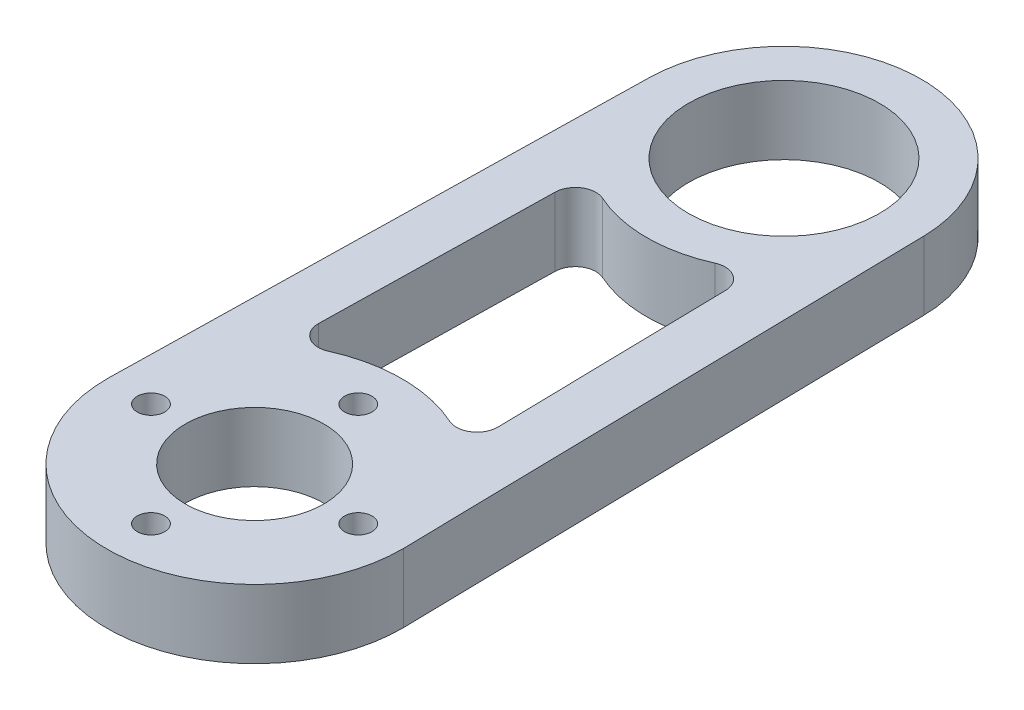
ISO-10303-21;
HEADER;
FILE_DESCRIPTION(('STEP AP214'),'2;1');
FILE_NAME('part.step','',(''),(''),'','','');
FILE_SCHEMA(('AUTOMOTIVE_DESIGN { 1 0 10303 214 1 1 1 1 }'));
ENDSEC;
DATA;
#1=APPLICATION_CONTEXT('core data for automotive mechanical design processes');
#2=APPLICATION_PROTOCOL_DEFINITION('international standard','automotive_design',2000,#1);
#3=PRODUCT_CONTEXT('',#1,'mechanical');
#4=PRODUCT('Part','Part','',(#3));
#5=PRODUCT_RELATED_PRODUCT_CATEGORY('part','',(#4));
#6=PRODUCT_DEFINITION_FORMATION('','',#4);
#7=PRODUCT_DEFINITION_CONTEXT('part definition',#1,'design');
#8=PRODUCT_DEFINITION('design','',#6,#7);
#9=PRODUCT_DEFINITION_SHAPE('','',#8);
#10=(LENGTH_UNIT() NAMED_UNIT(*) SI_UNIT(.MILLI.,.METRE.));
#11=(NAMED_UNIT(*) PLANE_ANGLE_UNIT() SI_UNIT($,.RADIAN.));
#12=(NAMED_UNIT(*) SI_UNIT($,.STERADIAN.) SOLID_ANGLE_UNIT());
#13=UNCERTAINTY_MEASURE_WITH_UNIT(LENGTH_MEASURE(1.E-05),#10,'distance_accuracy_value','');
#14=(GEOMETRIC_REPRESENTATION_CONTEXT(3) GLOBAL_UNCERTAINTY_ASSIGNED_CONTEXT((#13)) GLOBAL_UNIT_ASSIGNED_CONTEXT((#10,
#11,#12)) REPRESENTATION_CONTEXT('',''));
#15=CARTESIAN_POINT('',(0.,0.,0.));
#16=DIRECTION('',(0.,0.,1.));
#17=DIRECTION('',(1.,0.,0.));
#18=AXIS2_PLACEMENT_3D('',#15,#16,#17);
#19=CARTESIAN_POINT('',(0.,10.,0.));
#20=DIRECTION('',(0.,1.,0.));
#21=DIRECTION('',(0.,0.,1.));
#22=AXIS2_PLACEMENT_3D('',#19,#20,#21);
#23=PLANE('',#22);
#24=CARTESIAN_POINT('',(0.,10.,-15.1));
#25=DIRECTION('',(0.,1.,0.));
#26=DIRECTION('',(0.,0.,1.));
#27=AXIS2_PLACEMENT_3D('',#24,#25,#26);
#28=CIRCLE('',#27,2.);
#29=CARTESIAN_POINT('',(0.,10.,-13.1));
#30=VERTEX_POINT('',#29);
#31=EDGE_CURVE('E348',#30,#30,#28,.T.);
#32=ORIENTED_EDGE('',*,*,#31,.F.);
#33=EDGE_LOOP('',(#32));
#34=FACE_BOUND('',#33,.T.);
#35=CARTESIAN_POINT('',(15.1,10.,0.));
#36=DIRECTION('',(0.,1.,0.));
#37=DIRECTION('',(0.,0.,1.));
#38=AXIS2_PLACEMENT_3D('',#35,#36,#37);
#39=CIRCLE('',#38,2.);
#40=CARTESIAN_POINT('',(15.1,10.,2.));
#41=VERTEX_POINT('',#40);
#42=EDGE_CURVE('E166',#41,#41,#39,.T.);
#43=ORIENTED_EDGE('',*,*,#42,.F.);
#44=EDGE_LOOP('',(#43));
#45=FACE_BOUND('',#44,.T.);
#46=CARTESIAN_POINT('',(0.,10.,-77.125));
#47=DIRECTION('',(0.,1.,0.));
#48=DIRECTION('',(0.,0.,1.));
#49=AXIS2_PLACEMENT_3D('',#46,#47,#48);
#50=CIRCLE('',#49,13.91353128046);
#51=CARTESIAN_POINT('',(0.,10.,-63.21146871954));
#52=VERTEX_POINT('',#51);
#53=EDGE_CURVE('E202',#52,#52,#50,.T.);
#54=ORIENTED_EDGE('',*,*,#53,.F.);
#55=EDGE_LOOP('',(#54));
#56=FACE_BOUND('',#55,.T.);
#57=CARTESIAN_POINT('',(0.,10.,0.));
#58=DIRECTION('',(0.,1.,0.));
#59=DIRECTION('',(0.,0.,1.));
#60=AXIS2_PLACEMENT_3D('',#57,#58,#59);
#61=CIRCLE('',#60,21.5);
#62=CARTESIAN_POINT('',(-21.4989833019733,10.,-0.209086062360846));
#63=VERTEX_POINT('',#62);
#64=CARTESIAN_POINT('',(21.4989833019733,10.,-0.209086062360846));
#65=VERTEX_POINT('',#64);
#66=EDGE_CURVE('E208',#63,#65,#61,.T.);
#67=ORIENTED_EDGE('',*,*,#66,.T.);
#68=DIRECTION('',(-0.0194357996688067,0.,-0.999811107005335));
#69=VECTOR('',#68,1.);
#70=CARTESIAN_POINT('',(21.4989833019733,10.,-0.209086062360846));
#71=LINE('',#70,#69);
#72=CARTESIAN_POINT('',(19.996222140098,10.,-77.5137159938233));
#73=VERTEX_POINT('',#72);
#74=EDGE_CURVE('E211',#65,#73,#71,.T.);
#75=ORIENTED_EDGE('',*,*,#74,.T.);
#76=CARTESIAN_POINT('',(0.,10.,-77.125));
#77=DIRECTION('',(0.,1.,0.));
#78=DIRECTION('',(0.,0.,1.));
#79=AXIS2_PLACEMENT_3D('',#76,#77,#78);
#80=CIRCLE('',#79,20.);
#81=CARTESIAN_POINT('',(-19.996222140098,10.,-77.5137159938233));
#82=VERTEX_POINT('',#81);
#83=EDGE_CURVE('E214',#73,#82,#80,.T.);
#84=ORIENTED_EDGE('',*,*,#83,.T.);
#85=DIRECTION('',(-0.0194357996688067,0.,0.999811107005335));
#86=VECTOR('',#85,1.);
#87=CARTESIAN_POINT('',(-21.4989833019733,10.,-0.209086062360846));
#88=LINE('',#87,#86);
#89=EDGE_CURVE('E216',#82,#63,#88,.T.);
#90=ORIENTED_EDGE('',*,*,#89,.T.);
#91=EDGE_LOOP('',(#67,#75,#84,#90));
#92=FACE_BOUND('',#91,.T.);
#93=CARTESIAN_POINT('',(0.,10.,0.));
#94=DIRECTION('',(0.,1.,0.));
#95=DIRECTION('',(0.,0.,1.));
#96=AXIS2_PLACEMENT_3D('',#93,#94,#95);
#97=CIRCLE('',#96,10.1);
#98=CARTESIAN_POINT('',(0.,10.,10.1));
#99=VERTEX_POINT('',#98);
#100=EDGE_CURVE('E196',#99,#99,#97,.T.);
#101=ORIENTED_EDGE('',*,*,#100,.F.);
#102=EDGE_LOOP('',(#101));
#103=FACE_BOUND('',#102,.T.);
#104=CARTESIAN_POINT('',(0.,10.,0.));
#105=DIRECTION('',(0.,-1.,0.));
#106=DIRECTION('',(0.,0.,-1.));
#107=AXIS2_PLACEMENT_3D('',#104,#105,#106);
#108=CIRCLE('',#107,21.5);
#109=CARTESIAN_POINT('',(-8.8347388916758,10.,-19.6009537705671));
#110=VERTEX_POINT('',#109);
#111=CARTESIAN_POINT('',(8.8347388916758,10.,-19.6009537705672));
#112=VERTEX_POINT('',#111);
#113=EDGE_CURVE('E136',#110,#112,#108,.T.);
#114=ORIENTED_EDGE('',*,*,#113,.F.);
#115=CARTESIAN_POINT('',(-10.0674931556306,10.,-22.3359705757626));
#116=DIRECTION('',(0.,1.,0.));
#117=DIRECTION('',(0.,0.,1.));
#118=AXIS2_PLACEMENT_3D('',#115,#116,#117);
#119=CIRCLE('',#118,3.);
#120=CARTESIAN_POINT('',(-13.0669257096839,10.,-22.3943174153088));
#121=VERTEX_POINT('',#120);
#122=EDGE_CURVE('E128',#121,#110,#119,.T.);
#123=ORIENTED_EDGE('',*,*,#122,.F.);
#124=DIRECTION('',(-0.0194489465153976,0.,0.999810851351115));
#125=VECTOR('',#124,1.);
#126=CARTESIAN_POINT('',(-13.0669257096839,10.,-22.3943174153088));
#127=LINE('',#126,#125);
#128=CARTESIAN_POINT('',(-12.4093868221489,10.,-56.1963803919542));
#129=VERTEX_POINT('',#128);
#130=EDGE_CURVE('E163',#129,#121,#127,.T.);
#131=ORIENTED_EDGE('',*,*,#130,.F.);
#132=CARTESIAN_POINT('',(-9.40995426809551,10.,-56.138033552408));
#133=DIRECTION('',(0.,1.,0.));
#134=DIRECTION('',(0.,0.,-1.));
#135=AXIS2_PLACEMENT_3D('',#132,#133,#134);
#136=CIRCLE('',#135,3.);
#137=CARTESIAN_POINT('',(-8.18256892877871,10.,-58.8754639586157));
#138=VERTEX_POINT('',#137);
#139=EDGE_CURVE('E161',#138,#129,#136,.T.);
#140=ORIENTED_EDGE('',*,*,#139,.F.);
#141=CARTESIAN_POINT('',(0.,10.,-77.125));
#142=DIRECTION('',(0.,-1.,0.));
#143=DIRECTION('',(0.,0.,1.));
#144=AXIS2_PLACEMENT_3D('',#141,#142,#143);
#145=CIRCLE('',#144,20.);
#146=CARTESIAN_POINT('',(8.1825689287787,10.,-58.8754639586157));
#147=VERTEX_POINT('',#146);
#148=EDGE_CURVE('E159',#147,#138,#145,.T.);
#149=ORIENTED_EDGE('',*,*,#148,.F.);
#150=CARTESIAN_POINT('',(9.40995426809551,10.,-56.138033552408));
#151=DIRECTION('',(0.,1.,0.));
#152=DIRECTION('',(0.,0.,1.));
#153=AXIS2_PLACEMENT_3D('',#150,#151,#152);
#154=CIRCLE('',#153,3.);
#155=CARTESIAN_POINT('',(12.4093868221489,10.,-56.1963803919542));
#156=VERTEX_POINT('',#155);
#157=EDGE_CURVE('E157',#156,#147,#154,.T.);
#158=ORIENTED_EDGE('',*,*,#157,.F.);
#159=DIRECTION('',(-0.0194489465153976,0.,-0.999810851351115));
#160=VECTOR('',#159,1.);
#161=CARTESIAN_POINT('',(13.0669257096839,10.,-22.3943174153088));
#162=LINE('',#161,#160);
#163=CARTESIAN_POINT('',(13.0669257096839,10.,-22.3943174153088));
#164=VERTEX_POINT('',#163);
#165=EDGE_CURVE('E152',#164,#156,#162,.T.);
#166=ORIENTED_EDGE('',*,*,#165,.F.);
#167=CARTESIAN_POINT('',(10.0674931556306,10.,-22.3359705757626));
#168=DIRECTION('',(0.,1.,0.));
#169=DIRECTION('',(0.,0.,-1.));
#170=AXIS2_PLACEMENT_3D('',#167,#168,#169);
#171=CIRCLE('',#170,3.);
#172=EDGE_CURVE('E150',#112,#164,#171,.T.);
#173=ORIENTED_EDGE('',*,*,#172,.F.);
#174=EDGE_LOOP('',(#114,#123,#131,#140,#149,#158,#166,#173));
#175=FACE_BOUND('',#174,.T.);
#176=CARTESIAN_POINT('',(-15.1,10.,0.));
#177=DIRECTION('',(0.,1.,0.));
#178=DIRECTION('',(0.,0.,-1.));
#179=AXIS2_PLACEMENT_3D('',#176,#177,#178);
#180=CIRCLE('',#179,2.);
#181=CARTESIAN_POINT('',(-15.1,10.,-2.));
#182=VERTEX_POINT('',#181);
#183=EDGE_CURVE('E354',#182,#182,#180,.T.);
#184=ORIENTED_EDGE('',*,*,#183,.F.);
#185=EDGE_LOOP('',(#184));
#186=FACE_BOUND('',#185,.T.);
#187=CARTESIAN_POINT('',(0.,10.,15.1));
#188=DIRECTION('',(0.,1.,0.));
#189=DIRECTION('',(0.,0.,-1.));
#190=AXIS2_PLACEMENT_3D('',#187,#188,#189);
#191=CIRCLE('',#190,2.);
#192=CARTESIAN_POINT('',(0.,10.,13.1));
#193=VERTEX_POINT('',#192);
#194=EDGE_CURVE('E339',#193,#193,#191,.T.);
#195=ORIENTED_EDGE('',*,*,#194,.F.);
#196=EDGE_LOOP('',(#195));
#197=FACE_BOUND('',#196,.T.);
#198=ADVANCED_FACE('F39',(#34,#45,#56,#92,#103,#175,#186,#197),#23,.T.);
#199=CARTESIAN_POINT('',(0.,0.,0.));
#200=DIRECTION('',(0.,1.,0.));
#201=DIRECTION('',(0.,0.,1.));
#202=AXIS2_PLACEMENT_3D('',#199,#200,#201);
#203=PLANE('',#202);
#204=CARTESIAN_POINT('',(0.,0.,0.));
#205=DIRECTION('',(0.,1.,0.));
#206=DIRECTION('',(0.,0.,1.));
#207=AXIS2_PLACEMENT_3D('',#204,#205,#206);
#208=CIRCLE('',#207,10.1);
#209=CARTESIAN_POINT('',(0.,0.,10.1));
#210=VERTEX_POINT('',#209);
#211=EDGE_CURVE('E144',#210,#210,#208,.T.);
#212=ORIENTED_EDGE('',*,*,#211,.T.);
#213=EDGE_LOOP('',(#212));
#214=FACE_BOUND('',#213,.T.);
#215=CARTESIAN_POINT('',(0.,0.,-77.125));
#216=DIRECTION('',(0.,1.,0.));
#217=DIRECTION('',(0.,0.,1.));
#218=AXIS2_PLACEMENT_3D('',#215,#216,#217);
#219=CIRCLE('',#218,13.91353128046);
#220=CARTESIAN_POINT('',(0.,0.,-63.21146871954));
#221=VERTEX_POINT('',#220);
#222=EDGE_CURVE('E199',#221,#221,#219,.T.);
#223=ORIENTED_EDGE('',*,*,#222,.T.);
#224=EDGE_LOOP('',(#223));
#225=FACE_BOUND('',#224,.T.);
#226=CARTESIAN_POINT('',(0.,0.,0.));
#227=DIRECTION('',(0.,1.,0.));
#228=DIRECTION('',(0.,0.,1.));
#229=AXIS2_PLACEMENT_3D('',#226,#227,#228);
#230=CIRCLE('',#229,21.5);
#231=CARTESIAN_POINT('',(-21.4989833019733,0.,-0.209086062360846));
#232=VERTEX_POINT('',#231);
#233=CARTESIAN_POINT('',(21.4989833019733,0.,-0.209086062360846));
#234=VERTEX_POINT('',#233);
#235=EDGE_CURVE('E205',#232,#234,#230,.T.);
#236=ORIENTED_EDGE('',*,*,#235,.F.);
#237=DIRECTION('',(-0.0194357996688067,0.,0.999811107005335));
#238=VECTOR('',#237,1.);
#239=CARTESIAN_POINT('',(-21.4989833019733,0.,-0.209086062360846));
#240=LINE('',#239,#238);
#241=CARTESIAN_POINT('',(-19.996222140098,0.,-77.5137159938233));
#242=VERTEX_POINT('',#241);
#243=EDGE_CURVE('E212',#242,#232,#240,.T.);
#244=ORIENTED_EDGE('',*,*,#243,.F.);
#245=CARTESIAN_POINT('',(0.,0.,-77.125));
#246=DIRECTION('',(0.,1.,0.));
#247=DIRECTION('',(0.,0.,1.));
#248=AXIS2_PLACEMENT_3D('',#245,#246,#247);
#249=CIRCLE('',#248,20.);
#250=CARTESIAN_POINT('',(19.996222140098,0.,-77.5137159938233));
#251=VERTEX_POINT('',#250);
#252=EDGE_CURVE('E223',#251,#242,#249,.T.);
#253=ORIENTED_EDGE('',*,*,#252,.F.);
#254=DIRECTION('',(-0.0194357996688067,0.,-0.999811107005335));
#255=VECTOR('',#254,1.);
#256=CARTESIAN_POINT('',(21.4989833019733,0.,-0.209086062360846));
#257=LINE('',#256,#255);
#258=EDGE_CURVE('E221',#234,#251,#257,.T.);
#259=ORIENTED_EDGE('',*,*,#258,.F.);
#260=EDGE_LOOP('',(#236,#244,#253,#259));
#261=FACE_BOUND('',#260,.T.);
#262=CARTESIAN_POINT('',(-10.0674931556306,0.,-22.3359705757626));
#263=DIRECTION('',(0.,1.,0.));
#264=DIRECTION('',(0.,0.,1.));
#265=AXIS2_PLACEMENT_3D('',#262,#263,#264);
#266=CIRCLE('',#265,3.);
#267=CARTESIAN_POINT('',(-13.0669257096839,0.,-22.3943174153088));
#268=VERTEX_POINT('',#267);
#269=CARTESIAN_POINT('',(-8.8347388916758,0.,-19.6009537705671));
#270=VERTEX_POINT('',#269);
#271=EDGE_CURVE('E62',#268,#270,#266,.T.);
#272=ORIENTED_EDGE('',*,*,#271,.T.);
#273=CARTESIAN_POINT('',(0.,0.,0.));
#274=DIRECTION('',(0.,-1.,0.));
#275=DIRECTION('',(0.,0.,-1.));
#276=AXIS2_PLACEMENT_3D('',#273,#274,#275);
#277=CIRCLE('',#276,21.5);
#278=CARTESIAN_POINT('',(8.8347388916758,0.,-19.6009537705672));
#279=VERTEX_POINT('',#278);
#280=EDGE_CURVE('E143',#270,#279,#277,.T.);
#281=ORIENTED_EDGE('',*,*,#280,.T.);
#282=CARTESIAN_POINT('',(10.0674931556306,0.,-22.3359705757626));
#283=DIRECTION('',(0.,1.,0.));
#284=DIRECTION('',(0.,0.,-1.));
#285=AXIS2_PLACEMENT_3D('',#282,#283,#284);
#286=CIRCLE('',#285,3.);
#287=CARTESIAN_POINT('',(13.0669257096839,0.,-22.3943174153088));
#288=VERTEX_POINT('',#287);
#289=EDGE_CURVE('E168',#279,#288,#286,.T.);
#290=ORIENTED_EDGE('',*,*,#289,.T.);
#291=DIRECTION('',(-0.0194489465153976,0.,-0.999810851351115));
#292=VECTOR('',#291,1.);
#293=CARTESIAN_POINT('',(13.0669257096839,0.,-22.3943174153088));
#294=LINE('',#293,#292);
#295=CARTESIAN_POINT('',(12.4093868221489,0.,-56.1963803919542));
#296=VERTEX_POINT('',#295);
#297=EDGE_CURVE('E171',#288,#296,#294,.T.);
#298=ORIENTED_EDGE('',*,*,#297,.T.);
#299=CARTESIAN_POINT('',(9.40995426809551,0.,-56.138033552408));
#300=DIRECTION('',(0.,1.,0.));
#301=DIRECTION('',(0.,0.,1.));
#302=AXIS2_PLACEMENT_3D('',#299,#300,#301);
#303=CIRCLE('',#302,3.);
#304=CARTESIAN_POINT('',(8.1825689287787,0.,-58.8754639586157));
#305=VERTEX_POINT('',#304);
#306=EDGE_CURVE('E174',#296,#305,#303,.T.);
#307=ORIENTED_EDGE('',*,*,#306,.T.);
#308=CARTESIAN_POINT('',(0.,0.,-77.125));
#309=DIRECTION('',(0.,-1.,0.));
#310=DIRECTION('',(0.,0.,1.));
#311=AXIS2_PLACEMENT_3D('',#308,#309,#310);
#312=CIRCLE('',#311,20.);
#313=CARTESIAN_POINT('',(-8.18256892877871,0.,-58.8754639586157));
#314=VERTEX_POINT('',#313);
#315=EDGE_CURVE('E177',#305,#314,#312,.T.);
#316=ORIENTED_EDGE('',*,*,#315,.T.);
#317=CARTESIAN_POINT('',(-9.40995426809551,0.,-56.138033552408));
#318=DIRECTION('',(0.,1.,0.));
#319=DIRECTION('',(0.,0.,-1.));
#320=AXIS2_PLACEMENT_3D('',#317,#318,#319);
#321=CIRCLE('',#320,3.);
#322=CARTESIAN_POINT('',(-12.4093868221489,0.,-56.1963803919542));
#323=VERTEX_POINT('',#322);
#324=EDGE_CURVE('E180',#314,#323,#321,.T.);
#325=ORIENTED_EDGE('',*,*,#324,.T.);
#326=DIRECTION('',(-0.0194489465153976,0.,0.999810851351115));
#327=VECTOR('',#326,1.);
#328=CARTESIAN_POINT('',(-13.0669257096839,0.,-22.3943174153088));
#329=LINE('',#328,#327);
#330=EDGE_CURVE('E137',#323,#268,#329,.T.);
#331=ORIENTED_EDGE('',*,*,#330,.T.);
#332=EDGE_LOOP('',(#272,#281,#290,#298,#307,#316,#325,#331));
#333=FACE_BOUND('',#332,.T.);
#334=CARTESIAN_POINT('',(15.1,0.,0.));
#335=DIRECTION('',(0.,1.,0.));
#336=DIRECTION('',(0.,0.,1.));
#337=AXIS2_PLACEMENT_3D('',#334,#335,#336);
#338=CIRCLE('',#337,2.);
#339=CARTESIAN_POINT('',(15.1,0.,2.));
#340=VERTEX_POINT('',#339);
#341=EDGE_CURVE('E357',#340,#340,#338,.T.);
#342=ORIENTED_EDGE('',*,*,#341,.T.);
#343=EDGE_LOOP('',(#342));
#344=FACE_BOUND('',#343,.T.);
#345=CARTESIAN_POINT('',(-15.1,0.,0.));
#346=DIRECTION('',(0.,1.,0.));
#347=DIRECTION('',(0.,0.,-1.));
#348=AXIS2_PLACEMENT_3D('',#345,#346,#347);
#349=CIRCLE('',#348,2.);
#350=CARTESIAN_POINT('',(-15.1,0.,-2.));
#351=VERTEX_POINT('',#350);
#352=EDGE_CURVE('E351',#351,#351,#349,.T.);
#353=ORIENTED_EDGE('',*,*,#352,.T.);
#354=EDGE_LOOP('',(#353));
#355=FACE_BOUND('',#354,.T.);
#356=CARTESIAN_POINT('',(0.,0.,-15.1));
#357=DIRECTION('',(0.,1.,0.));
#358=DIRECTION('',(0.,0.,1.));
#359=AXIS2_PLACEMENT_3D('',#356,#357,#358);
#360=CIRCLE('',#359,2.);
#361=CARTESIAN_POINT('',(0.,0.,-13.1));
#362=VERTEX_POINT('',#361);
#363=EDGE_CURVE('E345',#362,#362,#360,.T.);
#364=ORIENTED_EDGE('',*,*,#363,.T.);
#365=EDGE_LOOP('',(#364));
#366=FACE_BOUND('',#365,.T.);
#367=CARTESIAN_POINT('',(0.,0.,15.1));
#368=DIRECTION('',(0.,1.,0.));
#369=DIRECTION('',(0.,0.,-1.));
#370=AXIS2_PLACEMENT_3D('',#367,#368,#369);
#371=CIRCLE('',#370,2.);
#372=CARTESIAN_POINT('',(0.,0.,13.1));
#373=VERTEX_POINT('',#372);
#374=EDGE_CURVE('E342',#373,#373,#371,.T.);
#375=ORIENTED_EDGE('',*,*,#374,.T.);
#376=EDGE_LOOP('',(#375));
#377=FACE_BOUND('',#376,.T.);
#378=ADVANCED_FACE('F241',(#214,#225,#261,#333,#344,#355,#366,#377),#203,.F.);
#379=CARTESIAN_POINT('',(0.,10.,0.));
#380=DIRECTION('',(0.,-1.,0.));
#381=DIRECTION('',(0.,0.,-1.));
#382=AXIS2_PLACEMENT_3D('',#379,#380,#381);
#383=CYLINDRICAL_SURFACE('',#382,21.5);
#384=ORIENTED_EDGE('',*,*,#235,.T.);
#385=DIRECTION('',(0.,-1.,0.));
#386=VECTOR('',#385,1.);
#387=CARTESIAN_POINT('',(21.4989833019733,10.,-0.209086062360846));
#388=LINE('',#387,#386);
#389=EDGE_CURVE('E11',#65,#234,#388,.T.);
#390=ORIENTED_EDGE('',*,*,#389,.F.);
#391=ORIENTED_EDGE('',*,*,#66,.F.);
#392=DIRECTION('',(0.,-1.,0.));
#393=VECTOR('',#392,1.);
#394=CARTESIAN_POINT('',(-21.4989833019733,10.,-0.209086062360846));
#395=LINE('',#394,#393);
#396=EDGE_CURVE('E218',#63,#232,#395,.T.);
#397=ORIENTED_EDGE('',*,*,#396,.T.);
#398=EDGE_LOOP('',(#384,#390,#391,#397));
#399=FACE_BOUND('',#398,.T.);
#400=ADVANCED_FACE('F41',(#399),#383,.T.);
#401=CARTESIAN_POINT('',(21.4989833019733,10.,-0.209086062360846));
#402=DIRECTION('',(-0.999811107005335,0.,0.0194357996688067));
#403=DIRECTION('',(0.0194357996688067,0.,0.999811107005335));
#404=AXIS2_PLACEMENT_3D('',#401,#402,#403);
#405=PLANE('',#404);
#406=ORIENTED_EDGE('',*,*,#258,.T.);
#407=DIRECTION('',(0.,-1.,0.));
#408=VECTOR('',#407,1.);
#409=CARTESIAN_POINT('',(19.996222140098,10.,-77.5137159938233));
#410=LINE('',#409,#408);
#411=EDGE_CURVE('E47',#73,#251,#410,.T.);
#412=ORIENTED_EDGE('',*,*,#411,.F.);
#413=ORIENTED_EDGE('',*,*,#74,.F.);
#414=ORIENTED_EDGE('',*,*,#389,.T.);
#415=EDGE_LOOP('',(#406,#412,#413,#414));
#416=FACE_BOUND('',#415,.T.);
#417=ADVANCED_FACE('F252',(#416),#405,.F.);
#418=CARTESIAN_POINT('',(0.,10.,-77.125));
#419=DIRECTION('',(0.,-1.,0.));
#420=DIRECTION('',(0.,0.,-1.));
#421=AXIS2_PLACEMENT_3D('',#418,#419,#420);
#422=CYLINDRICAL_SURFACE('',#421,20.);
#423=ORIENTED_EDGE('',*,*,#252,.T.);
#424=DIRECTION('',(0.,-1.,0.));
#425=VECTOR('',#424,1.);
#426=CARTESIAN_POINT('',(-19.996222140098,10.,-77.5137159938233));
#427=LINE('',#426,#425);
#428=EDGE_CURVE('E228',#82,#242,#427,.T.);
#429=ORIENTED_EDGE('',*,*,#428,.F.);
#430=ORIENTED_EDGE('',*,*,#83,.F.);
#431=ORIENTED_EDGE('',*,*,#411,.T.);
#432=EDGE_LOOP('',(#423,#429,#430,#431));
#433=FACE_BOUND('',#432,.T.);
#434=ADVANCED_FACE('F235',(#433),#422,.T.);
#435=CARTESIAN_POINT('',(-21.4989833019733,10.,-0.209086062360846));
#436=DIRECTION('',(0.999811107005335,0.,0.0194357996688067));
#437=DIRECTION('',(0.0194357996688067,0.,-0.999811107005335));
#438=AXIS2_PLACEMENT_3D('',#435,#436,#437);
#439=PLANE('',#438);
#440=ORIENTED_EDGE('',*,*,#243,.T.);
#441=ORIENTED_EDGE('',*,*,#396,.F.);
#442=ORIENTED_EDGE('',*,*,#89,.F.);
#443=ORIENTED_EDGE('',*,*,#428,.T.);
#444=EDGE_LOOP('',(#440,#441,#442,#443));
#445=FACE_BOUND('',#444,.T.);
#446=ADVANCED_FACE('F245',(#445),#439,.F.);
#447=CARTESIAN_POINT('',(0.,10.,-77.125));
#448=DIRECTION('',(0.,-1.,0.));
#449=DIRECTION('',(0.,0.,-1.));
#450=AXIS2_PLACEMENT_3D('',#447,#448,#449);
#451=CYLINDRICAL_SURFACE('',#450,13.91353128046);
#452=ORIENTED_EDGE('',*,*,#53,.T.);
#453=EDGE_LOOP('',(#452));
#454=FACE_BOUND('',#453,.T.);
#455=ORIENTED_EDGE('',*,*,#222,.F.);
#456=EDGE_LOOP('',(#455));
#457=FACE_BOUND('',#456,.T.);
#458=ADVANCED_FACE('F270',(#454,#457),#451,.F.);
#459=CARTESIAN_POINT('',(0.,10.,0.));
#460=DIRECTION('',(0.,-1.,0.));
#461=DIRECTION('',(0.,0.,-1.));
#462=AXIS2_PLACEMENT_3D('',#459,#460,#461);
#463=CYLINDRICAL_SURFACE('',#462,10.1);
#464=ORIENTED_EDGE('',*,*,#100,.T.);
#465=EDGE_LOOP('',(#464));
#466=FACE_BOUND('',#465,.T.);
#467=ORIENTED_EDGE('',*,*,#211,.F.);
#468=EDGE_LOOP('',(#467));
#469=FACE_BOUND('',#468,.T.);
#470=ADVANCED_FACE('F277',(#466,#469),#463,.F.);
#471=CARTESIAN_POINT('',(-10.0674931556306,10.,-22.3359705757626));
#472=DIRECTION('',(0.,-1.,0.));
#473=DIRECTION('',(0.,0.,-1.));
#474=AXIS2_PLACEMENT_3D('',#471,#472,#473);
#475=CYLINDRICAL_SURFACE('',#474,3.);
#476=ORIENTED_EDGE('',*,*,#271,.F.);
#477=DIRECTION('',(0.,-1.,0.));
#478=VECTOR('',#477,1.);
#479=CARTESIAN_POINT('',(-13.0669257096839,10.,-22.3943174153088));
#480=LINE('',#479,#478);
#481=EDGE_CURVE('E132',#121,#268,#480,.T.);
#482=ORIENTED_EDGE('',*,*,#481,.F.);
#483=ORIENTED_EDGE('',*,*,#122,.T.);
#484=DIRECTION('',(0.,-1.,0.));
#485=VECTOR('',#484,1.);
#486=CARTESIAN_POINT('',(-8.8347388916758,10.,-19.6009537705671));
#487=LINE('',#486,#485);
#488=EDGE_CURVE('E131',#110,#270,#487,.T.);
#489=ORIENTED_EDGE('',*,*,#488,.T.);
#490=EDGE_LOOP('',(#476,#482,#483,#489));
#491=FACE_BOUND('',#490,.T.);
#492=ADVANCED_FACE('F130',(#491),#475,.F.);
#493=CARTESIAN_POINT('',(0.,10.,0.));
#494=DIRECTION('',(0.,-1.,0.));
#495=DIRECTION('',(0.,0.,-1.));
#496=AXIS2_PLACEMENT_3D('',#493,#494,#495);
#497=CYLINDRICAL_SURFACE('',#496,21.5);
#498=ORIENTED_EDGE('',*,*,#280,.F.);
#499=ORIENTED_EDGE('',*,*,#488,.F.);
#500=ORIENTED_EDGE('',*,*,#113,.T.);
#501=DIRECTION('',(0.,-1.,0.));
#502=VECTOR('',#501,1.);
#503=CARTESIAN_POINT('',(8.8347388916758,10.,-19.6009537705672));
#504=LINE('',#503,#502);
#505=EDGE_CURVE('E145',#112,#279,#504,.T.);
#506=ORIENTED_EDGE('',*,*,#505,.T.);
#507=EDGE_LOOP('',(#498,#499,#500,#506));
#508=FACE_BOUND('',#507,.T.);
#509=ADVANCED_FACE('F140',(#508),#497,.T.);
#510=CARTESIAN_POINT('',(10.0674931556306,10.,-22.3359705757626));
#511=DIRECTION('',(0.,-1.,0.));
#512=DIRECTION('',(0.,0.,-1.));
#513=AXIS2_PLACEMENT_3D('',#510,#511,#512);
#514=CYLINDRICAL_SURFACE('',#513,3.);
#515=ORIENTED_EDGE('',*,*,#289,.F.);
#516=ORIENTED_EDGE('',*,*,#505,.F.);
#517=ORIENTED_EDGE('',*,*,#172,.T.);
#518=DIRECTION('',(0.,-1.,0.));
#519=VECTOR('',#518,1.);
#520=CARTESIAN_POINT('',(13.0669257096839,10.,-22.3943174153088));
#521=LINE('',#520,#519);
#522=EDGE_CURVE('E193',#164,#288,#521,.T.);
#523=ORIENTED_EDGE('',*,*,#522,.T.);
#524=EDGE_LOOP('',(#515,#516,#517,#523));
#525=FACE_BOUND('',#524,.T.);
#526=ADVANCED_FACE('F296',(#525),#514,.F.);
#527=CARTESIAN_POINT('',(13.0669257096839,10.,-22.3943174153088));
#528=DIRECTION('',(-0.999810851351115,0.,0.0194489465153976));
#529=DIRECTION('',(0.0194489465153976,0.,0.999810851351115));
#530=AXIS2_PLACEMENT_3D('',#527,#528,#529);
#531=PLANE('',#530);
#532=ORIENTED_EDGE('',*,*,#297,.F.);
#533=ORIENTED_EDGE('',*,*,#522,.F.);
#534=ORIENTED_EDGE('',*,*,#165,.T.);
#535=DIRECTION('',(0.,-1.,0.));
#536=VECTOR('',#535,1.);
#537=CARTESIAN_POINT('',(12.4093868221489,10.,-56.1963803919542));
#538=LINE('',#537,#536);
#539=EDGE_CURVE('E191',#156,#296,#538,.T.);
#540=ORIENTED_EDGE('',*,*,#539,.T.);
#541=EDGE_LOOP('',(#532,#533,#534,#540));
#542=FACE_BOUND('',#541,.T.);
#543=ADVANCED_FACE('F299',(#542),#531,.T.);
#544=CARTESIAN_POINT('',(9.40995426809551,10.,-56.138033552408));
#545=DIRECTION('',(0.,-1.,0.));
#546=DIRECTION('',(0.,0.,-1.));
#547=AXIS2_PLACEMENT_3D('',#544,#545,#546);
#548=CYLINDRICAL_SURFACE('',#547,3.);
#549=ORIENTED_EDGE('',*,*,#306,.F.);
#550=ORIENTED_EDGE('',*,*,#539,.F.);
#551=ORIENTED_EDGE('',*,*,#157,.T.);
#552=DIRECTION('',(0.,-1.,0.));
#553=VECTOR('',#552,1.);
#554=CARTESIAN_POINT('',(8.1825689287787,10.,-58.8754639586157));
#555=LINE('',#554,#553);
#556=EDGE_CURVE('E189',#147,#305,#555,.T.);
#557=ORIENTED_EDGE('',*,*,#556,.T.);
#558=EDGE_LOOP('',(#549,#550,#551,#557));
#559=FACE_BOUND('',#558,.T.);
#560=ADVANCED_FACE('F303',(#559),#548,.F.);
#561=CARTESIAN_POINT('',(0.,10.,-77.125));
#562=DIRECTION('',(0.,-1.,0.));
#563=DIRECTION('',(0.,0.,-1.));
#564=AXIS2_PLACEMENT_3D('',#561,#562,#563);
#565=CYLINDRICAL_SURFACE('',#564,20.);
#566=ORIENTED_EDGE('',*,*,#315,.F.);
#567=ORIENTED_EDGE('',*,*,#556,.F.);
#568=ORIENTED_EDGE('',*,*,#148,.T.);
#569=DIRECTION('',(0.,-1.,0.));
#570=VECTOR('',#569,1.);
#571=CARTESIAN_POINT('',(-8.18256892877871,10.,-58.8754639586157));
#572=LINE('',#571,#570);
#573=EDGE_CURVE('E187',#138,#314,#572,.T.);
#574=ORIENTED_EDGE('',*,*,#573,.T.);
#575=EDGE_LOOP('',(#566,#567,#568,#574));
#576=FACE_BOUND('',#575,.T.);
#577=ADVANCED_FACE('F307',(#576),#565,.T.);
#578=CARTESIAN_POINT('',(-9.40995426809551,10.,-56.138033552408));
#579=DIRECTION('',(0.,-1.,0.));
#580=DIRECTION('',(0.,0.,-1.));
#581=AXIS2_PLACEMENT_3D('',#578,#579,#580);
#582=CYLINDRICAL_SURFACE('',#581,3.);
#583=ORIENTED_EDGE('',*,*,#324,.F.);
#584=ORIENTED_EDGE('',*,*,#573,.F.);
#585=ORIENTED_EDGE('',*,*,#139,.T.);
#586=DIRECTION('',(0.,-1.,0.));
#587=VECTOR('',#586,1.);
#588=CARTESIAN_POINT('',(-12.4093868221489,10.,-56.1963803919542));
#589=LINE('',#588,#587);
#590=EDGE_CURVE('E54',#129,#323,#589,.T.);
#591=ORIENTED_EDGE('',*,*,#590,.T.);
#592=EDGE_LOOP('',(#583,#584,#585,#591));
#593=FACE_BOUND('',#592,.T.);
#594=ADVANCED_FACE('F311',(#593),#582,.F.);
#595=CARTESIAN_POINT('',(-13.0669257096839,10.,-22.3943174153088));
#596=DIRECTION('',(0.999810851351115,0.,0.0194489465153976));
#597=DIRECTION('',(0.0194489465153976,0.,-0.999810851351115));
#598=AXIS2_PLACEMENT_3D('',#595,#596,#597);
#599=PLANE('',#598);
#600=ORIENTED_EDGE('',*,*,#330,.F.);
#601=ORIENTED_EDGE('',*,*,#590,.F.);
#602=ORIENTED_EDGE('',*,*,#130,.T.);
#603=ORIENTED_EDGE('',*,*,#481,.T.);
#604=EDGE_LOOP('',(#600,#601,#602,#603));
#605=FACE_BOUND('',#604,.T.);
#606=ADVANCED_FACE('F315',(#605),#599,.T.);
#607=CARTESIAN_POINT('',(15.1,10.,0.));
#608=DIRECTION('',(0.,-1.,0.));
#609=DIRECTION('',(0.,0.,-1.));
#610=AXIS2_PLACEMENT_3D('',#607,#608,#609);
#611=CYLINDRICAL_SURFACE('',#610,2.);
#612=ORIENTED_EDGE('',*,*,#42,.T.);
#613=EDGE_LOOP('',(#612));
#614=FACE_BOUND('',#613,.T.);
#615=ORIENTED_EDGE('',*,*,#341,.F.);
#616=EDGE_LOOP('',(#615));
#617=FACE_BOUND('',#616,.T.);
#618=ADVANCED_FACE('F319',(#614,#617),#611,.F.);
#619=CARTESIAN_POINT('',(-15.1,10.,0.));
#620=DIRECTION('',(0.,-1.,0.));
#621=DIRECTION('',(0.,0.,-1.));
#622=AXIS2_PLACEMENT_3D('',#619,#620,#621);
#623=CYLINDRICAL_SURFACE('',#622,2.);
#624=ORIENTED_EDGE('',*,*,#183,.T.);
#625=EDGE_LOOP('',(#624));
#626=FACE_BOUND('',#625,.T.);
#627=ORIENTED_EDGE('',*,*,#352,.F.);
#628=EDGE_LOOP('',(#627));
#629=FACE_BOUND('',#628,.T.);
#630=ADVANCED_FACE('F322',(#626,#629),#623,.F.);
#631=CARTESIAN_POINT('',(0.,10.,-15.1));
#632=DIRECTION('',(0.,-1.,0.));
#633=DIRECTION('',(0.,0.,-1.));
#634=AXIS2_PLACEMENT_3D('',#631,#632,#633);
#635=CYLINDRICAL_SURFACE('',#634,2.);
#636=ORIENTED_EDGE('',*,*,#31,.T.);
#637=EDGE_LOOP('',(#636));
#638=FACE_BOUND('',#637,.T.);
#639=ORIENTED_EDGE('',*,*,#363,.F.);
#640=EDGE_LOOP('',(#639));
#641=FACE_BOUND('',#640,.T.);
#642=ADVANCED_FACE('F326',(#638,#641),#635,.F.);
#643=CARTESIAN_POINT('',(0.,10.,15.1));
#644=DIRECTION('',(0.,-1.,0.));
#645=DIRECTION('',(0.,0.,-1.));
#646=AXIS2_PLACEMENT_3D('',#643,#644,#645);
#647=CYLINDRICAL_SURFACE('',#646,2.);
#648=ORIENTED_EDGE('',*,*,#194,.T.);
#649=EDGE_LOOP('',(#648));
#650=FACE_BOUND('',#649,.T.);
#651=ORIENTED_EDGE('',*,*,#374,.F.);
#652=EDGE_LOOP('',(#651));
#653=FACE_BOUND('',#652,.T.);
#654=ADVANCED_FACE('F330',(#650,#653),#647,.F.);
#655=CLOSED_SHELL('',(#198,#378,#400,#417,#434,#446,#458,#470,#492,#509,#526,#543,#560,#577,
#594,#606,#618,#630,#642,#654));
#656=MANIFOLD_SOLID_BREP('B2',#655);
#657=ADVANCED_BREP_SHAPE_REPRESENTATION('',(#18,#656),#14);
#658=SHAPE_DEFINITION_REPRESENTATION(#9,#657);
ENDSEC;
END-ISO-10303-21;
